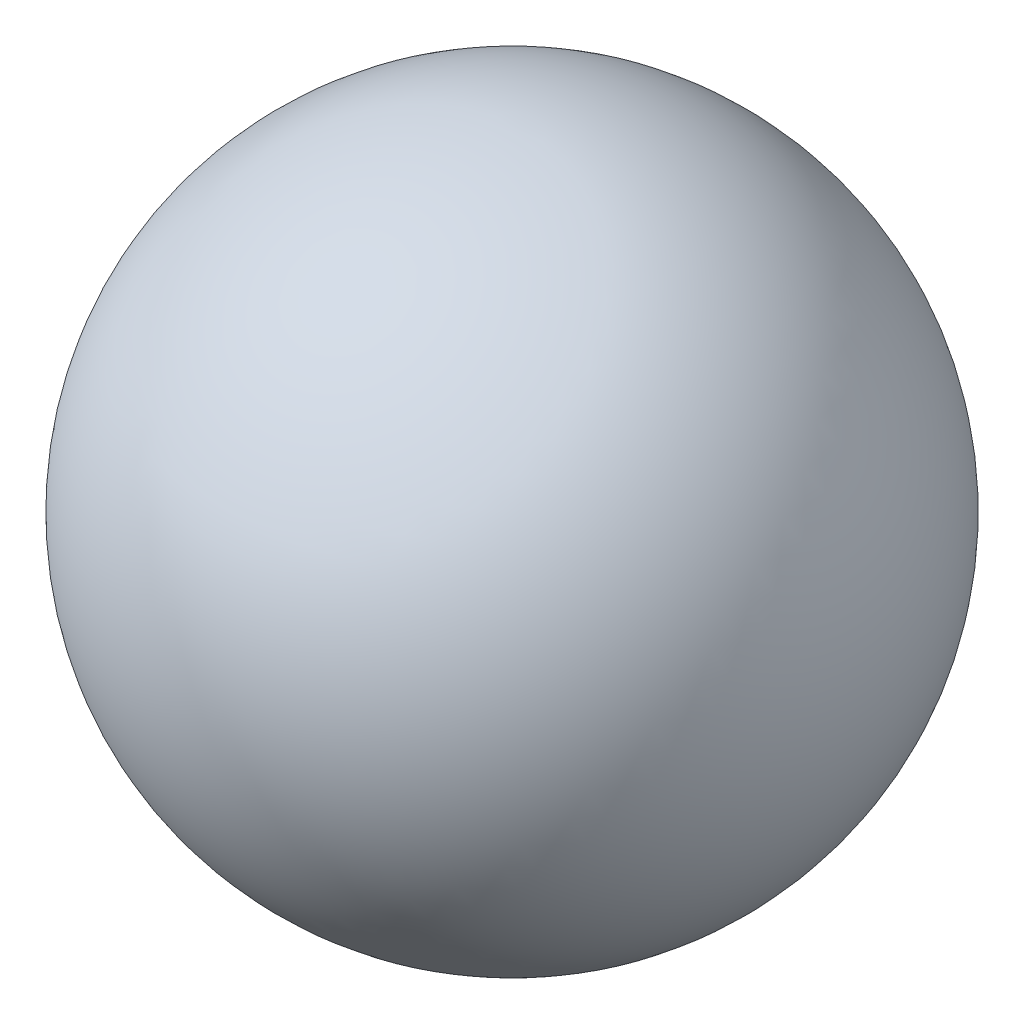
ISO-10303-21;
HEADER;
FILE_DESCRIPTION(('STEP AP214'),'2;1');
FILE_NAME('part.step','',(''),(''),'','','');
FILE_SCHEMA(('AUTOMOTIVE_DESIGN { 1 0 10303 214 1 1 1 1 }'));
ENDSEC;
DATA;
#1=APPLICATION_CONTEXT('core data for automotive mechanical design processes');
#2=APPLICATION_PROTOCOL_DEFINITION('international standard','automotive_design',2000,#1);
#3=PRODUCT_CONTEXT('',#1,'mechanical');
#4=PRODUCT('Part','Part','',(#3));
#5=PRODUCT_RELATED_PRODUCT_CATEGORY('part','',(#4));
#6=PRODUCT_DEFINITION_FORMATION('','',#4);
#7=PRODUCT_DEFINITION_CONTEXT('part definition',#1,'design');
#8=PRODUCT_DEFINITION('design','',#6,#7);
#9=PRODUCT_DEFINITION_SHAPE('','',#8);
#10=(LENGTH_UNIT() NAMED_UNIT(*) SI_UNIT(.MILLI.,.METRE.));
#11=(NAMED_UNIT(*) PLANE_ANGLE_UNIT() SI_UNIT($,.RADIAN.));
#12=(NAMED_UNIT(*) SI_UNIT($,.STERADIAN.) SOLID_ANGLE_UNIT());
#13=UNCERTAINTY_MEASURE_WITH_UNIT(LENGTH_MEASURE(1.E-05),#10,'distance_accuracy_value','');
#14=(GEOMETRIC_REPRESENTATION_CONTEXT(3) GLOBAL_UNCERTAINTY_ASSIGNED_CONTEXT((#13)) GLOBAL_UNIT_ASSIGNED_CONTEXT((#10,
#11,#12)) REPRESENTATION_CONTEXT('',''));
#15=CARTESIAN_POINT('',(0.,0.,0.));
#16=DIRECTION('',(0.,0.,1.));
#17=DIRECTION('',(1.,0.,0.));
#18=AXIS2_PLACEMENT_3D('',#15,#16,#17);
#19=CARTESIAN_POINT('',(0.,0.,0.));
#20=DIRECTION('',(0.,1.,0.));
#21=DIRECTION('',(1.,0.,0.));
#22=AXIS2_PLACEMENT_3D('',#19,#20,#21);
#23=SPHERICAL_SURFACE('',#22,7.);
#24=CARTESIAN_POINT('',(0.,7.,0.));
#25=VERTEX_POINT('',#24);
#26=VERTEX_LOOP('',#25);
#27=FACE_BOUND('',#26,.T.);
#28=ADVANCED_FACE('F30',(#27),#23,.T.);
#29=CLOSED_SHELL('',(#28));
#30=MANIFOLD_SOLID_BREP('B2',#29);
#31=ADVANCED_BREP_SHAPE_REPRESENTATION('',(#18,#30),#14);
#32=SHAPE_DEFINITION_REPRESENTATION(#9,#31);
ENDSEC;
END-ISO-10303-21;
